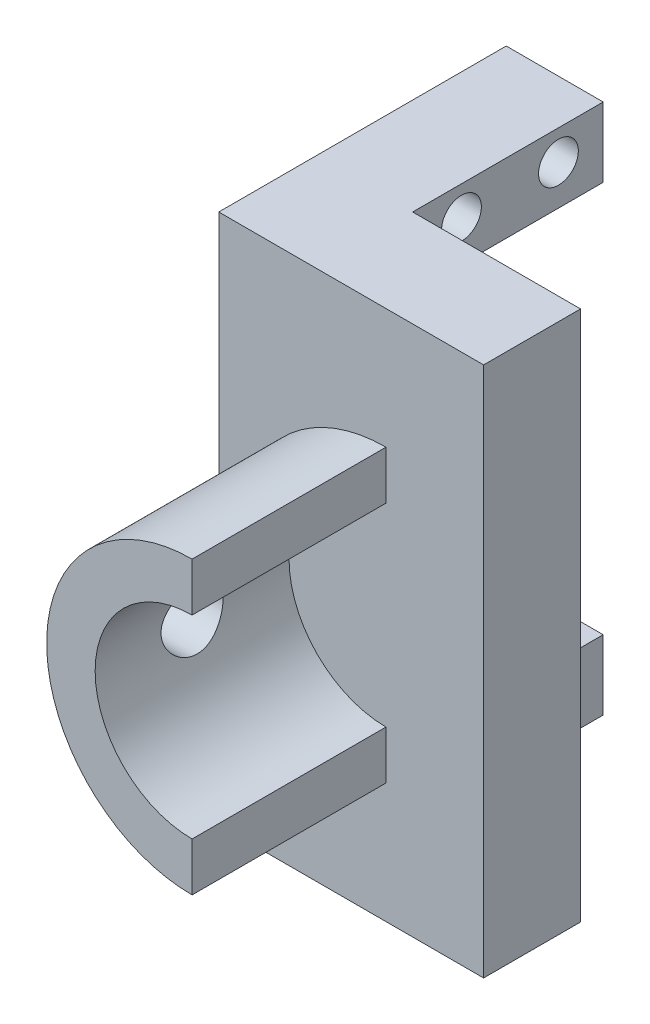
ISO-10303-21;
HEADER;
FILE_DESCRIPTION(('STEP AP214'),'2;1');
FILE_NAME('part.step','',(''),(''),'','','');
FILE_SCHEMA(('AUTOMOTIVE_DESIGN { 1 0 10303 214 1 1 1 1 }'));
ENDSEC;
DATA;
#1=APPLICATION_CONTEXT('core data for automotive mechanical design processes');
#2=APPLICATION_PROTOCOL_DEFINITION('international standard','automotive_design',2000,#1);
#3=PRODUCT_CONTEXT('',#1,'mechanical');
#4=PRODUCT('Part','Part','',(#3));
#5=PRODUCT_RELATED_PRODUCT_CATEGORY('part','',(#4));
#6=PRODUCT_DEFINITION_FORMATION('','',#4);
#7=PRODUCT_DEFINITION_CONTEXT('part definition',#1,'design');
#8=PRODUCT_DEFINITION('design','',#6,#7);
#9=PRODUCT_DEFINITION_SHAPE('','',#8);
#10=(LENGTH_UNIT() NAMED_UNIT(*) SI_UNIT(.MILLI.,.METRE.));
#11=(NAMED_UNIT(*) PLANE_ANGLE_UNIT() SI_UNIT($,.RADIAN.));
#12=(NAMED_UNIT(*) SI_UNIT($,.STERADIAN.) SOLID_ANGLE_UNIT());
#13=UNCERTAINTY_MEASURE_WITH_UNIT(LENGTH_MEASURE(1.E-05),#10,'distance_accuracy_value','');
#14=(GEOMETRIC_REPRESENTATION_CONTEXT(3) GLOBAL_UNCERTAINTY_ASSIGNED_CONTEXT((#13)) GLOBAL_UNIT_ASSIGNED_CONTEXT((#10,
#11,#12)) REPRESENTATION_CONTEXT('',''));
#15=CARTESIAN_POINT('',(0.,0.,0.));
#16=DIRECTION('',(0.,0.,1.));
#17=DIRECTION('',(1.,0.,0.));
#18=AXIS2_PLACEMENT_3D('',#15,#16,#17);
#19=CARTESIAN_POINT('',(0.,0.,-9.906));
#20=DIRECTION('',(0.,0.,-1.));
#21=DIRECTION('',(-1.,0.,0.));
#22=AXIS2_PLACEMENT_3D('',#19,#20,#21);
#23=PLANE('',#22);
#24=DIRECTION('',(0.,1.,0.));
#25=VECTOR('',#24,1.);
#26=CARTESIAN_POINT('',(9.97584999999999,27.1272,-9.906));
#27=LINE('',#26,#25);
#28=CARTESIAN_POINT('',(9.97584999999999,-27.1272,-9.906));
#29=VERTEX_POINT('',#28);
#30=CARTESIAN_POINT('',(9.97584999999999,27.1272,-9.906));
#31=VERTEX_POINT('',#30);
#32=EDGE_CURVE('E146',#29,#31,#27,.T.);
#33=ORIENTED_EDGE('',*,*,#32,.F.);
#34=DIRECTION('',(-1.,0.,0.));
#35=VECTOR('',#34,1.);
#36=CARTESIAN_POINT('',(-17.08785,-27.1272,-9.906));
#37=LINE('',#36,#35);
#38=CARTESIAN_POINT('',(-7.18185,-27.1272,-9.906));
#39=VERTEX_POINT('',#38);
#40=EDGE_CURVE('E154',#29,#39,#37,.T.);
#41=ORIENTED_EDGE('',*,*,#40,.T.);
#42=DIRECTION('',(0.,-1.,0.));
#43=VECTOR('',#42,1.);
#44=CARTESIAN_POINT('',(-7.18185,-27.1272,-9.906));
#45=LINE('',#44,#43);
#46=CARTESIAN_POINT('',(-7.18185,-20.0152,-9.906));
#47=VERTEX_POINT('',#46);
#48=EDGE_CURVE('E304',#47,#39,#45,.T.);
#49=ORIENTED_EDGE('',*,*,#48,.F.);
#50=DIRECTION('',(1.,0.,0.));
#51=VECTOR('',#50,1.);
#52=CARTESIAN_POINT('',(-17.08785,-20.0152,-9.906));
#53=LINE('',#52,#51);
#54=CARTESIAN_POINT('',(-17.08785,-20.0152,-9.906));
#55=VERTEX_POINT('',#54);
#56=EDGE_CURVE('E309',#55,#47,#53,.T.);
#57=ORIENTED_EDGE('',*,*,#56,.F.);
#58=DIRECTION('',(0.,1.,0.));
#59=VECTOR('',#58,1.);
#60=CARTESIAN_POINT('',(-17.08785,-27.1272,-9.906));
#61=LINE('',#60,#59);
#62=CARTESIAN_POINT('',(-17.08785,20.0152,-9.906));
#63=VERTEX_POINT('',#62);
#64=EDGE_CURVE('E167',#55,#63,#61,.T.);
#65=ORIENTED_EDGE('',*,*,#64,.T.);
#66=DIRECTION('',(-1.,0.,0.));
#67=VECTOR('',#66,1.);
#68=CARTESIAN_POINT('',(-17.08785,20.0152,-9.906));
#69=LINE('',#68,#67);
#70=CARTESIAN_POINT('',(-7.18185,20.0152,-9.906));
#71=VERTEX_POINT('',#70);
#72=EDGE_CURVE('E345',#71,#63,#69,.T.);
#73=ORIENTED_EDGE('',*,*,#72,.F.);
#74=DIRECTION('',(0.,-1.,0.));
#75=VECTOR('',#74,1.);
#76=CARTESIAN_POINT('',(-7.18185,27.1272,-9.906));
#77=LINE('',#76,#75);
#78=CARTESIAN_POINT('',(-7.18185,27.1272,-9.906));
#79=VERTEX_POINT('',#78);
#80=EDGE_CURVE('E319',#79,#71,#77,.T.);
#81=ORIENTED_EDGE('',*,*,#80,.F.);
#82=DIRECTION('',(1.,0.,0.));
#83=VECTOR('',#82,1.);
#84=CARTESIAN_POINT('',(-17.08785,27.1272,-9.906));
#85=LINE('',#84,#83);
#86=EDGE_CURVE('E158',#79,#31,#85,.T.);
#87=ORIENTED_EDGE('',*,*,#86,.T.);
#88=EDGE_LOOP('',(#33,#41,#49,#57,#65,#73,#81,#87));
#89=FACE_BOUND('',#88,.T.);
#90=ADVANCED_FACE('F42',(#89),#23,.T.);
#91=CARTESIAN_POINT('',(0.,0.,19.812));
#92=DIRECTION('',(0.,0.,-1.));
#93=DIRECTION('',(-1.,0.,0.));
#94=AXIS2_PLACEMENT_3D('',#91,#92,#93);
#95=CYLINDRICAL_SURFACE('',#94,9.906);
#96=CARTESIAN_POINT('',(-9.38340082272946,3.17500000000001,9.906));
#97=CARTESIAN_POINT('',(-9.38340133010901,3.17499953903506,9.73264884542391));
#98=CARTESIAN_POINT('',(-9.38825715963943,3.16075472324,9.55929209338769));
#99=CARTESIAN_POINT('',(-9.40706434772498,3.1043257570464,9.21768781886109));
#100=CARTESIAN_POINT('',(-9.42101779273341,3.06213519751669,9.04944147766173));
#101=CARTESIAN_POINT('',(-9.45628094770359,2.95142750605806,8.7230576836702));
#102=CARTESIAN_POINT('',(-9.47757710955197,2.88295883397299,8.56490224453796));
#103=CARTESIAN_POINT('',(-9.52510700553775,2.72180167990557,8.26227622172001));
#104=CARTESIAN_POINT('',(-9.55134169611072,2.62910850505674,8.11780829703056));
#105=CARTESIAN_POINT('',(-9.60685630655788,2.41854478822556,7.84143587130159));
#106=CARTESIAN_POINT('',(-9.63620787712043,2.29994827423912,7.71009873342643));
#107=CARTESIAN_POINT('',(-9.6940409357979,2.04249629356499,7.46879483813952));
#108=CARTESIAN_POINT('',(-9.72252229521997,1.90363784777256,7.35883122882422));
#109=CARTESIAN_POINT('',(-9.77622921809102,1.60549943387128,7.16086560894773));
#110=CARTESIAN_POINT('',(-9.80136062407833,1.44581048456765,7.07345173560357));
#111=CARTESIAN_POINT('',(-9.84469647245604,1.11305344149498,6.9269464698132));
#112=CARTESIAN_POINT('',(-9.86290263233179,0.939988677802082,6.86784805408899));
#113=CARTESIAN_POINT('',(-9.88982935915226,0.591336355969303,6.78155683094694));
#114=CARTESIAN_POINT('',(-9.89883780880962,0.41601165347821,6.7533934648548));
#115=CARTESIAN_POINT('',(-9.90737280091693,0.0629093181982272,6.72669255035582));
#116=CARTESIAN_POINT('',(-9.90690160743614,-0.114867718751698,6.72814792796135));
#117=CARTESIAN_POINT('',(-9.89672883377991,-0.460982753354979,6.76001333816891));
#118=CARTESIAN_POINT('',(-9.88736291172926,-0.629429142765774,6.78937047998244));
#119=CARTESIAN_POINT('',(-9.86086911434444,-0.958864233681696,6.87447336134971));
#120=CARTESIAN_POINT('',(-9.84374072449016,-1.11985244005587,6.93022085014729));
#121=CARTESIAN_POINT('',(-9.80320475439315,-1.43218240257421,7.0671748715743));
#122=CARTESIAN_POINT('',(-9.77972077356479,-1.58337705006025,7.14869334628164));
#123=CARTESIAN_POINT('',(-9.72893673648756,-1.87026250480182,7.33462259159284));
#124=CARTESIAN_POINT('',(-9.70163567836561,-2.0059492246236,7.43903937644866));
#125=CARTESIAN_POINT('',(-9.64470398038788,-2.26424039095278,7.67316958474088));
#126=CARTESIAN_POINT('',(-9.61502367587066,-2.38601336778421,7.80378949197259));
#127=CARTESIAN_POINT('',(-9.55769991346078,-2.60618195859897,8.08386523472301));
#128=CARTESIAN_POINT('',(-9.53005672249221,-2.70457451277706,8.23332353171653));
#129=CARTESIAN_POINT('',(-9.47967827585143,-2.87622483297347,8.5492898728612));
#130=CARTESIAN_POINT('',(-9.45700756438128,-2.94915858260893,8.71598500409704));
#131=CARTESIAN_POINT('',(-9.41989380059001,-3.06565137470001,9.06019545607295));
#132=CARTESIAN_POINT('',(-9.40544760898891,-3.10922162630249,9.23770661967933));
#133=CARTESIAN_POINT('',(-9.38712048822755,-3.16411316255718,9.59051034557862));
#134=CARTESIAN_POINT('',(-9.38282074126458,-3.17671375743821,9.76558219887671));
#135=CARTESIAN_POINT('',(-9.38410752367471,-3.17291201870695,10.1153562264413));
#136=CARTESIAN_POINT('',(-9.3896924268535,-3.15651445578879,10.2900584567832));
#137=CARTESIAN_POINT('',(-9.40970418756109,-3.09632761940791,10.6285100976424));
#138=CARTESIAN_POINT('',(-9.42385227170711,-3.05340110038972,10.7924311465685));
#139=CARTESIAN_POINT('',(-9.45909661381935,-2.94239621229261,11.1107203518729));
#140=CARTESIAN_POINT('',(-9.48019404316233,-2.874313602685,11.2650868925355));
#141=CARTESIAN_POINT('',(-9.52774108643855,-2.71261315798632,11.5649877749034));
#142=CARTESIAN_POINT('',(-9.55433167781735,-2.61829369124762,11.7101208739917));
#143=CARTESIAN_POINT('',(-9.6095840888019,-2.40760687283756,11.9829644804155));
#144=CARTESIAN_POINT('',(-9.63824647277214,-2.29123349948743,12.1106702128999));
#145=CARTESIAN_POINT('',(-9.69593652535424,-2.03366431016807,12.3508260247314));
#146=CARTESIAN_POINT('',(-9.72492491808365,-1.89160256664382,12.4623593617688));
#147=CARTESIAN_POINT('',(-9.77874854404601,-1.59007310585205,12.6600487687238));
#148=CARTESIAN_POINT('',(-9.80358395359351,-1.43060612799761,12.7462059161037));
#149=CARTESIAN_POINT('',(-9.84617005172749,-1.09971270486089,12.889881003148));
#150=CARTESIAN_POINT('',(-9.86397024277404,-0.92838016838966,12.9475997824493));
#151=CARTESIAN_POINT('',(-9.89069687851541,-0.577764235401472,13.0331949986557));
#152=CARTESIAN_POINT('',(-9.89962625951355,-0.398483490340113,13.0610813105617));
#153=CARTESIAN_POINT('',(-9.90740032725738,-0.0454781964175458,13.0853846800917));
#154=CARTESIAN_POINT('',(-9.90666835072807,0.128147126546088,13.0831227161865));
#155=CARTESIAN_POINT('',(-9.89622665348614,0.472430473192687,13.0504124254821));
#156=CARTESIAN_POINT('',(-9.88651757068729,0.643088706839338,13.0199661014652));
#157=CARTESIAN_POINT('',(-9.85935481238169,0.974277122404261,12.9326065929411));
#158=CARTESIAN_POINT('',(-9.84200938210128,1.13491424665938,12.8760628163297));
#159=CARTESIAN_POINT('',(-9.80136097448059,1.44449364041947,12.7384499976972));
#160=CARTESIAN_POINT('',(-9.77805695157488,1.59343385144344,12.6573766509682));
#161=CARTESIAN_POINT('',(-9.72689320608753,1.88108625417519,12.4697193240969));
#162=CARTESIAN_POINT('',(-9.69890225138927,2.01925567841205,12.362339546976));
#163=CARTESIAN_POINT('',(-9.64187566236921,2.27605033064853,12.1265019402886));
#164=CARTESIAN_POINT('',(-9.61283970977304,2.39466954181593,11.9980376458753));
#165=CARTESIAN_POINT('',(-9.55578495937843,2.61324313994996,11.7182354017688));
#166=CARTESIAN_POINT('',(-9.52783848079125,2.71238880180854,11.5662490463719));
#167=CARTESIAN_POINT('',(-9.47742003674041,2.88363592085698,11.2469186132444));
#168=CARTESIAN_POINT('',(-9.45494614536393,2.95574689692776,11.0795799669172));
#169=CARTESIAN_POINT('',(-9.41960211858886,3.06644435894395,10.7463403432));
#170=CARTESIAN_POINT('',(-9.40616879103593,3.10702803003376,10.5811622748788));
#171=CARTESIAN_POINT('',(-9.38806912491434,3.16130230167822,10.2459903549994));
#172=CARTESIAN_POINT('',(-9.38340032516461,3.1750004520481,10.0759978690004));
#173=CARTESIAN_POINT('',(-9.38340082272946,3.17500000000001,9.906));
#174=B_SPLINE_CURVE_WITH_KNOTS('',3,(#96,#97,#98,#99,#100,#101,#102,#103,#104,#105,#106,#107,
#108,#109,#110,#111,#112,#113,#114,#115,#116,#117,#118,#119,#120,#121,#122,#123,#124,#125,#126,
#127,#128,#129,#130,#131,#132,#133,#134,#135,#136,#137,#138,#139,#140,#141,#142,#143,#144,#145,
#146,#147,#148,#149,#150,#151,#152,#153,#154,#155,#156,#157,#158,#159,#160,#161,#162,#163,#164,
#165,#166,#167,#168,#169,#170,#171,#172,#173),.UNSPECIFIED.,.T.,.F.,(4,2,2,2,2,2,2,2,2,2,2,2,2,
2,2,2,2,2,2,2,2,2,2,2,2,2,2,2,2,2,2,2,2,2,2,2,2,2,4),(0.,0.519424913270037,1.03896899372475,
1.557559543668,2.07625063159029,2.61195145698115,3.14773112578965,3.69632464246906,
4.24478201718656,4.77549171645942,5.30607466525916,5.81739893053467,6.32875709290453,
6.84655855087935,7.36449617288678,7.90508126396071,8.44573706270556,8.99304239171275,
9.54013867525676,10.0642241589064,10.5882234295295,11.0960183198061,11.6038988474713,
12.1269412246057,12.6501266214326,13.1962977107937,13.742445606616,14.2846791015578,
14.8267330533656,15.3451174273333,15.863464967704,16.3746903114133,16.8860054224304,
17.4152743224352,17.94470580888,18.4928662860357,19.0408335748635,19.550353890646,
20.0597311057994),.UNSPECIFIED.);
#175=CARTESIAN_POINT('',(-9.38340082272946,3.17500000000001,9.906));
#176=VERTEX_POINT('',#175);
#177=EDGE_CURVE('E196',#176,#176,#174,.T.);
#178=ORIENTED_EDGE('',*,*,#177,.T.);
#179=EDGE_LOOP('',(#178));
#180=FACE_BOUND('',#179,.T.);
#181=CARTESIAN_POINT('',(0.,0.,0.));
#182=DIRECTION('',(0.,0.,-1.));
#183=DIRECTION('',(1.,0.,0.));
#184=AXIS2_PLACEMENT_3D('',#181,#182,#183);
#185=CIRCLE('',#184,9.906);
#186=CARTESIAN_POINT('',(0.,-9.906,0.));
#187=VERTEX_POINT('',#186);
#188=CARTESIAN_POINT('',(0.,9.906,0.));
#189=VERTEX_POINT('',#188);
#190=EDGE_CURVE('E204',#187,#189,#185,.T.);
#191=ORIENTED_EDGE('',*,*,#190,.T.);
#192=DIRECTION('',(0.,0.,-1.));
#193=VECTOR('',#192,1.);
#194=CARTESIAN_POINT('',(0.,9.906,19.812));
#195=LINE('',#194,#193);
#196=CARTESIAN_POINT('',(0.,9.906,19.812));
#197=VERTEX_POINT('',#196);
#198=EDGE_CURVE('E226',#197,#189,#195,.T.);
#199=ORIENTED_EDGE('',*,*,#198,.F.);
#200=CARTESIAN_POINT('',(0.,0.,19.812));
#201=DIRECTION('',(0.,0.,-1.));
#202=DIRECTION('',(1.,0.,0.));
#203=AXIS2_PLACEMENT_3D('',#200,#201,#202);
#204=CIRCLE('',#203,9.906);
#205=CARTESIAN_POINT('',(0.,-9.906,19.812));
#206=VERTEX_POINT('',#205);
#207=EDGE_CURVE('E205',#206,#197,#204,.T.);
#208=ORIENTED_EDGE('',*,*,#207,.F.);
#209=DIRECTION('',(0.,0.,-1.));
#210=VECTOR('',#209,1.);
#211=CARTESIAN_POINT('',(0.,-9.906,19.812));
#212=LINE('',#211,#210);
#213=EDGE_CURVE('E610',#206,#187,#212,.T.);
#214=ORIENTED_EDGE('',*,*,#213,.T.);
#215=EDGE_LOOP('',(#191,#199,#208,#214));
#216=FACE_BOUND('',#215,.T.);
#217=ADVANCED_FACE('F44',(#180,#216),#95,.F.);
#218=CARTESIAN_POINT('',(0.,14.859,19.812));
#219=DIRECTION('',(-1.,0.,0.));
#220=DIRECTION('',(0.,-1.,0.));
#221=AXIS2_PLACEMENT_3D('',#218,#219,#220);
#222=PLANE('',#221);
#223=DIRECTION('',(0.,1.,0.));
#224=VECTOR('',#223,1.);
#225=CARTESIAN_POINT('',(0.,14.859,0.));
#226=LINE('',#225,#224);
#227=CARTESIAN_POINT('',(0.,14.859,0.));
#228=VERTEX_POINT('',#227);
#229=EDGE_CURVE('E639',#189,#228,#226,.T.);
#230=ORIENTED_EDGE('',*,*,#229,.T.);
#231=DIRECTION('',(0.,0.,-1.));
#232=VECTOR('',#231,1.);
#233=CARTESIAN_POINT('',(0.,14.859,19.812));
#234=LINE('',#233,#232);
#235=CARTESIAN_POINT('',(0.,14.859,19.812));
#236=VERTEX_POINT('',#235);
#237=EDGE_CURVE('E627',#236,#228,#234,.T.);
#238=ORIENTED_EDGE('',*,*,#237,.F.);
#239=DIRECTION('',(0.,1.,0.));
#240=VECTOR('',#239,1.);
#241=CARTESIAN_POINT('',(0.,14.859,19.812));
#242=LINE('',#241,#240);
#243=EDGE_CURVE('E640',#197,#236,#242,.T.);
#244=ORIENTED_EDGE('',*,*,#243,.F.);
#245=ORIENTED_EDGE('',*,*,#198,.T.);
#246=EDGE_LOOP('',(#230,#238,#244,#245));
#247=FACE_BOUND('',#246,.T.);
#248=ADVANCED_FACE('F234',(#247),#222,.F.);
#249=CARTESIAN_POINT('',(0.,0.,19.812));
#250=DIRECTION('',(0.,0.,-1.));
#251=DIRECTION('',(-1.,0.,0.));
#252=AXIS2_PLACEMENT_3D('',#249,#250,#251);
#253=CYLINDRICAL_SURFACE('',#252,14.859);
#254=CARTESIAN_POINT('',(-14.859,0.,6.731));
#255=CARTESIAN_POINT('',(-14.8589967402807,0.176194698758512,6.73100615390929));
#256=CARTESIAN_POINT('',(-14.8558341487316,0.352464690339494,6.74571625608523));
#257=CARTESIAN_POINT('',(-14.8435232946697,0.700004573215136,6.80411091777772));
#258=CARTESIAN_POINT('',(-14.8343706220879,0.871270683386047,6.84781682516054));
#259=CARTESIAN_POINT('',(-14.8110995060966,1.20372928824128,6.9627770763868));
#260=CARTESIAN_POINT('',(-14.7969861321986,1.36493186988359,7.0340033036166));
#261=CARTESIAN_POINT('',(-14.7653198994555,1.67309151540792,7.20189466092664));
#262=CARTESIAN_POINT('',(-14.7477671614983,1.82004907970693,7.29855889694484));
#263=CARTESIAN_POINT('',(-14.710846253574,2.09781055044508,7.5161536710301));
#264=CARTESIAN_POINT('',(-14.6914564283995,2.22836438439464,7.63739978296034));
#265=CARTESIAN_POINT('',(-14.6532006490009,2.46744492072694,7.90003883947733));
#266=CARTESIAN_POINT('',(-14.6343347399326,2.57596972949991,8.04143351425317));
#267=CARTESIAN_POINT('',(-14.5990499486353,2.76900411692624,8.34219107927886));
#268=CARTESIAN_POINT('',(-14.582658848184,2.85324949654867,8.50172708938338));
#269=CARTESIAN_POINT('',(-14.5544894851331,2.99363950909869,8.833099328121));
#270=CARTESIAN_POINT('',(-14.5427106979775,3.04978733774958,9.00493415538473));
#271=CARTESIAN_POINT('',(-14.5253197612627,3.13156600030011,9.35331960636047));
#272=CARTESIAN_POINT('',(-14.5196184594067,3.15763849872747,9.52976201109498));
#273=CARTESIAN_POINT('',(-14.5147601053329,3.17989930053807,9.88460166685972));
#274=CARTESIAN_POINT('',(-14.5156022866531,3.17609110395543,10.0629986864944));
#275=CARTESIAN_POINT('',(-14.5236549469871,3.13905450421082,10.4134147192979));
#276=CARTESIAN_POINT('',(-14.5307547717111,3.10633727598315,10.5854906867116));
#277=CARTESIAN_POINT('',(-14.5503479995654,3.01322036016634,10.9216536547528));
#278=CARTESIAN_POINT('',(-14.5628416928619,2.95281918329287,11.0857402250577));
#279=CARTESIAN_POINT('',(-14.5919251097965,2.80557439137451,11.4027136334561));
#280=CARTESIAN_POINT('',(-14.6085453576114,2.71853254467572,11.5555054691589));
#281=CARTESIAN_POINT('',(-14.6439902404162,2.52061672720434,11.8445044122576));
#282=CARTESIAN_POINT('',(-14.6628151627169,2.40973964867375,11.980709353339));
#283=CARTESIAN_POINT('',(-14.7010243625657,2.16458623564626,12.2356130149233));
#284=CARTESIAN_POINT('',(-14.720412172529,2.02987477520951,12.3538931194276));
#285=CARTESIAN_POINT('',(-14.7572088033606,1.74231101142479,12.5662488511058));
#286=CARTESIAN_POINT('',(-14.7746175914816,1.58945840797806,12.6603240777902));
#287=CARTESIAN_POINT('',(-14.8055471952626,1.26945312621002,12.8216957581053));
#288=CARTESIAN_POINT('',(-14.8190603155283,1.10227297892278,12.888939308424));
#289=CARTESIAN_POINT('',(-14.8406185257147,0.758634071300985,12.994265263433));
#290=CARTESIAN_POINT('',(-14.8486643736777,0.582176600932672,13.0323517108756));
#291=CARTESIAN_POINT('',(-14.8582742394268,0.228584601098124,13.0776779685338));
#292=CARTESIAN_POINT('',(-14.8599584618844,0.0515265824636866,13.0854898988191));
#293=CARTESIAN_POINT('',(-14.8569913313245,-0.301364506824073,13.0715933167132));
#294=CARTESIAN_POINT('',(-14.8523403874159,-0.477197655839346,13.0498867105537));
#295=CARTESIAN_POINT('',(-14.8373011908791,-0.820766007096623,12.9780439161293));
#296=CARTESIAN_POINT('',(-14.8269731603418,-0.988566448702825,12.9282059959457));
#297=CARTESIAN_POINT('',(-14.8017350583752,-1.31342688303457,12.8018449249043));
#298=CARTESIAN_POINT('',(-14.7868246090968,-1.47048598876366,12.7253195734306));
#299=CARTESIAN_POINT('',(-14.7537781674759,-1.77178429310711,12.5465512260452));
#300=CARTESIAN_POINT('',(-14.7356007292247,-1.91581804912945,12.4439698043498));
#301=CARTESIAN_POINT('',(-14.6981246260166,-2.18483259780773,12.2164489351539));
#302=CARTESIAN_POINT('',(-14.6788258227448,-2.30981103316596,12.0915067255918));
#303=CARTESIAN_POINT('',(-14.6408696487408,-2.53941433408468,11.8201911507116));
#304=CARTESIAN_POINT('',(-14.6222294557648,-2.64364394108118,11.6734804545196));
#305=CARTESIAN_POINT('',(-14.5880886017231,-2.82598520570271,11.3642996057269));
#306=CARTESIAN_POINT('',(-14.5725878071325,-2.90409797422067,11.2018301238134));
#307=CARTESIAN_POINT('',(-14.5466243436289,-3.03147339907523,10.8666036860708));
#308=CARTESIAN_POINT('',(-14.5361339260237,-3.08089528887863,10.6939094881385));
#309=CARTESIAN_POINT('',(-14.5213263423454,-3.14995753034486,10.3424161010803));
#310=CARTESIAN_POINT('',(-14.5170082406671,-3.16960239566276,10.1636178414214));
#311=CARTESIAN_POINT('',(-14.5150912315555,-3.17836771261522,9.8089721693341));
#312=CARTESIAN_POINT('',(-14.5173545070886,-3.16811423663552,9.6331406837942));
#313=CARTESIAN_POINT('',(-14.5280345997088,-3.11876859344065,9.28577237702738));
#314=CARTESIAN_POINT('',(-14.5364513510251,-3.07967673446212,9.11423550991804));
#315=CARTESIAN_POINT('',(-14.5584243795644,-2.97406016283385,8.78079556895384));
#316=CARTESIAN_POINT('',(-14.5719643201825,-2.90762259049435,8.61886374601909));
#317=CARTESIAN_POINT('',(-14.6026652794361,-2.74927689188875,8.30835060375248));
#318=CARTESIAN_POINT('',(-14.6198266552515,-2.65736625294939,8.15977060336522));
#319=CARTESIAN_POINT('',(-14.6562513058028,-2.44858969371564,7.877083683838));
#320=CARTESIAN_POINT('',(-14.6755487857802,-2.33127591068657,7.74331187557933));
#321=CARTESIAN_POINT('',(-14.713837225414,-2.07593566464662,7.49714723193885));
#322=CARTESIAN_POINT('',(-14.7328281133487,-1.93790443074961,7.38475933447168));
#323=CARTESIAN_POINT('',(-14.7686392925732,-1.64300992132539,7.18323864343173));
#324=CARTESIAN_POINT('',(-14.7854301256152,-1.48593655747747,7.09440777380225));
#325=CARTESIAN_POINT('',(-14.814655517228,-1.15876647372612,6.94454745294218));
#326=CARTESIAN_POINT('',(-14.8270938037094,-0.988681051443419,6.88349419695408));
#327=CARTESIAN_POINT('',(-14.8439381172694,-0.681970334153463,6.8020674188608));
#328=CARTESIAN_POINT('',(-14.8495518817154,-0.547029695802136,6.77546704221143));
#329=CARTESIAN_POINT('',(-14.8570840190329,-0.274741233884757,6.73993129186872));
#330=CARTESIAN_POINT('',(-14.8590025418715,-0.137393508235846,6.73099520129043));
#331=CARTESIAN_POINT('',(-14.859,0.,6.731));
#332=B_SPLINE_CURVE_WITH_KNOTS('',3,(#254,#255,#256,#257,#258,#259,#260,#261,#262,#263,#264,
#265,#266,#267,#268,#269,#270,#271,#272,#273,#274,#275,#276,#277,#278,#279,#280,#281,#282,#283,
#284,#285,#286,#287,#288,#289,#290,#291,#292,#293,#294,#295,#296,#297,#298,#299,#300,#301,#302,
#303,#304,#305,#306,#307,#308,#309,#310,#311,#312,#313,#314,#315,#316,#317,#318,#319,#320,#321,
#322,#323,#324,#325,#326,#327,#328,#329,#330,#331),.UNSPECIFIED.,.T.,.F.,(4,2,2,2,2,2,2,2,2,2,2,
2,2,2,2,2,2,2,2,2,2,2,2,2,2,2,2,2,2,2,2,2,2,2,2,2,2,2,4),(0.,0.528081262460858,1.0565517514778,
1.58448374102957,2.11239717799228,2.64757401290652,3.18279683203095,3.72364100219877,
4.26442364453558,4.79715937397165,5.32983270307218,5.85327157616608,6.37673861145725,
6.90419954064707,7.43172928461683,7.97013042940942,8.50854048191244,9.0480069191691,
9.58739854362747,10.1165457053767,10.645658697776,11.1692642866017,11.6929130615744,
12.2237459587688,12.7546444711098,13.2948508040972,13.8350341562106,14.3721901169986,
14.9092646465717,15.4351741051875,15.9610779427456,16.4853187436111,17.0096112742104,
17.544033956719,18.0785798972879,18.6196778012776,19.1603111196782,19.572116256461,
19.9839046802578),.UNSPECIFIED.);
#333=CARTESIAN_POINT('',(-14.859,0.,6.731));
#334=VERTEX_POINT('',#333);
#335=EDGE_CURVE('E52',#334,#334,#332,.T.);
#336=ORIENTED_EDGE('',*,*,#335,.T.);
#337=EDGE_LOOP('',(#336));
#338=FACE_BOUND('',#337,.T.);
#339=CARTESIAN_POINT('',(0.,0.,0.));
#340=DIRECTION('',(0.,0.,1.));
#341=DIRECTION('',(1.,0.,0.));
#342=AXIS2_PLACEMENT_3D('',#339,#340,#341);
#343=CIRCLE('',#342,14.859);
#344=CARTESIAN_POINT('',(0.,-14.859,0.));
#345=VERTEX_POINT('',#344);
#346=EDGE_CURVE('E616',#228,#345,#343,.T.);
#347=ORIENTED_EDGE('',*,*,#346,.T.);
#348=DIRECTION('',(0.,0.,-1.));
#349=VECTOR('',#348,1.);
#350=CARTESIAN_POINT('',(0.,-14.859,19.812));
#351=LINE('',#350,#349);
#352=CARTESIAN_POINT('',(0.,-14.859,19.812));
#353=VERTEX_POINT('',#352);
#354=EDGE_CURVE('E613',#353,#345,#351,.T.);
#355=ORIENTED_EDGE('',*,*,#354,.F.);
#356=CARTESIAN_POINT('',(0.,0.,19.812));
#357=DIRECTION('',(0.,0.,1.));
#358=DIRECTION('',(1.,0.,0.));
#359=AXIS2_PLACEMENT_3D('',#356,#357,#358);
#360=CIRCLE('',#359,14.859);
#361=EDGE_CURVE('E629',#236,#353,#360,.T.);
#362=ORIENTED_EDGE('',*,*,#361,.F.);
#363=ORIENTED_EDGE('',*,*,#237,.T.);
#364=EDGE_LOOP('',(#347,#355,#362,#363));
#365=FACE_BOUND('',#364,.T.);
#366=ADVANCED_FACE('F230',(#338,#365),#253,.T.);
#367=CARTESIAN_POINT('',(0.,-9.906,19.812));
#368=DIRECTION('',(-1.,0.,0.));
#369=DIRECTION('',(0.,-1.,0.));
#370=AXIS2_PLACEMENT_3D('',#367,#368,#369);
#371=PLANE('',#370);
#372=DIRECTION('',(0.,1.,0.));
#373=VECTOR('',#372,1.);
#374=CARTESIAN_POINT('',(0.,-9.906,0.));
#375=LINE('',#374,#373);
#376=EDGE_CURVE('E607',#345,#187,#375,.T.);
#377=ORIENTED_EDGE('',*,*,#376,.T.);
#378=ORIENTED_EDGE('',*,*,#213,.F.);
#379=DIRECTION('',(0.,1.,0.));
#380=VECTOR('',#379,1.);
#381=CARTESIAN_POINT('',(0.,-9.906,19.812));
#382=LINE('',#381,#380);
#383=EDGE_CURVE('E623',#353,#206,#382,.T.);
#384=ORIENTED_EDGE('',*,*,#383,.F.);
#385=ORIENTED_EDGE('',*,*,#354,.T.);
#386=EDGE_LOOP('',(#377,#378,#384,#385));
#387=FACE_BOUND('',#386,.T.);
#388=ADVANCED_FACE('F233',(#387),#371,.F.);
#389=CARTESIAN_POINT('',(0.,0.,19.812));
#390=DIRECTION('',(0.,0.,1.));
#391=DIRECTION('',(1.,0.,0.));
#392=AXIS2_PLACEMENT_3D('',#389,#390,#391);
#393=PLANE('',#392);
#394=ORIENTED_EDGE('',*,*,#207,.T.);
#395=ORIENTED_EDGE('',*,*,#243,.T.);
#396=ORIENTED_EDGE('',*,*,#361,.T.);
#397=ORIENTED_EDGE('',*,*,#383,.T.);
#398=EDGE_LOOP('',(#394,#395,#396,#397));
#399=FACE_BOUND('',#398,.T.);
#400=ADVANCED_FACE('F212',(#399),#393,.T.);
#401=CARTESIAN_POINT('',(-14.859,0.,9.906));
#402=DIRECTION('',(1.,0.,0.));
#403=DIRECTION('',(0.,1.,0.));
#404=AXIS2_PLACEMENT_3D('',#401,#402,#403);
#405=CYLINDRICAL_SURFACE('',#404,3.175);
#406=ORIENTED_EDGE('',*,*,#335,.F.);
#407=EDGE_LOOP('',(#406));
#408=FACE_BOUND('',#407,.T.);
#409=ORIENTED_EDGE('',*,*,#177,.F.);
#410=EDGE_LOOP('',(#409));
#411=FACE_BOUND('',#410,.T.);
#412=ADVANCED_FACE('F207',(#408,#411),#405,.F.);
#413=CARTESIAN_POINT('',(-17.08785,-27.1272,-9.906));
#414=DIRECTION('',(0.,1.,0.));
#415=DIRECTION('',(-1.,0.,0.));
#416=AXIS2_PLACEMENT_3D('',#413,#414,#415);
#417=PLANE('',#416);
#418=ORIENTED_EDGE('',*,*,#40,.F.);
#419=DIRECTION('',(0.,0.,-1.));
#420=VECTOR('',#419,1.);
#421=CARTESIAN_POINT('',(9.97584999999999,-27.1272,19.812));
#422=LINE('',#421,#420);
#423=CARTESIAN_POINT('',(9.97584999999999,-27.1272,0.));
#424=VERTEX_POINT('',#423);
#425=EDGE_CURVE('E143',#424,#29,#422,.T.);
#426=ORIENTED_EDGE('',*,*,#425,.F.);
#427=DIRECTION('',(-1.,0.,0.));
#428=VECTOR('',#427,1.);
#429=CARTESIAN_POINT('',(-17.08785,-27.1272,0.));
#430=LINE('',#429,#428);
#431=CARTESIAN_POINT('',(-17.08785,-27.1272,0.));
#432=VERTEX_POINT('',#431);
#433=EDGE_CURVE('E184',#424,#432,#430,.T.);
#434=ORIENTED_EDGE('',*,*,#433,.T.);
#435=DIRECTION('',(0.,0.,1.));
#436=VECTOR('',#435,1.);
#437=CARTESIAN_POINT('',(-17.08785,-27.1272,-9.906));
#438=LINE('',#437,#436);
#439=CARTESIAN_POINT('',(-17.08785,-27.1272,-29.3751));
#440=VERTEX_POINT('',#439);
#441=EDGE_CURVE('E192',#440,#432,#438,.T.);
#442=ORIENTED_EDGE('',*,*,#441,.F.);
#443=DIRECTION('',(-1.,0.,0.));
#444=VECTOR('',#443,1.);
#445=CARTESIAN_POINT('',(-17.08785,-27.1272,-29.3751));
#446=LINE('',#445,#444);
#447=CARTESIAN_POINT('',(-7.18185,-27.1272,-29.3751));
#448=VERTEX_POINT('',#447);
#449=EDGE_CURVE('E290',#448,#440,#446,.T.);
#450=ORIENTED_EDGE('',*,*,#449,.F.);
#451=DIRECTION('',(0.,0.,1.));
#452=VECTOR('',#451,1.);
#453=CARTESIAN_POINT('',(-7.18185,-27.1272,-29.3751));
#454=LINE('',#453,#452);
#455=EDGE_CURVE('E165',#448,#39,#454,.T.);
#456=ORIENTED_EDGE('',*,*,#455,.T.);
#457=EDGE_LOOP('',(#418,#426,#434,#442,#450,#456));
#458=FACE_BOUND('',#457,.T.);
#459=ADVANCED_FACE('F162',(#458),#417,.F.);
#460=CARTESIAN_POINT('',(-17.08785,-27.1272,-9.906));
#461=DIRECTION('',(1.,0.,0.));
#462=DIRECTION('',(0.,0.,-1.));
#463=AXIS2_PLACEMENT_3D('',#460,#461,#462);
#464=PLANE('',#463);
#465=CARTESIAN_POINT('',(-17.08785,-24.0792,-24.8031));
#466=DIRECTION('',(-1.,0.,0.));
#467=DIRECTION('',(0.,0.,-1.));
#468=AXIS2_PLACEMENT_3D('',#465,#466,#467);
#469=CIRCLE('',#468,2.032);
#470=CARTESIAN_POINT('',(-17.08785,-24.0792,-26.8351));
#471=VERTEX_POINT('',#470);
#472=EDGE_CURVE('E267',#471,#471,#469,.T.);
#473=ORIENTED_EDGE('',*,*,#472,.F.);
#474=EDGE_LOOP('',(#473));
#475=FACE_BOUND('',#474,.T.);
#476=CARTESIAN_POINT('',(-17.08785,-24.0792,-14.8971));
#477=DIRECTION('',(-1.,0.,0.));
#478=DIRECTION('',(0.,0.,-1.));
#479=AXIS2_PLACEMENT_3D('',#476,#477,#478);
#480=CIRCLE('',#479,2.032);
#481=CARTESIAN_POINT('',(-17.08785,-24.0792,-16.9291));
#482=VERTEX_POINT('',#481);
#483=EDGE_CURVE('E271',#482,#482,#480,.T.);
#484=ORIENTED_EDGE('',*,*,#483,.F.);
#485=EDGE_LOOP('',(#484));
#486=FACE_BOUND('',#485,.T.);
#487=CARTESIAN_POINT('',(-17.08785,24.0792,-14.8971));
#488=DIRECTION('',(-1.,0.,0.));
#489=DIRECTION('',(0.,0.,1.));
#490=AXIS2_PLACEMENT_3D('',#487,#488,#489);
#491=CIRCLE('',#490,2.032);
#492=CARTESIAN_POINT('',(-17.08785,24.0792,-12.8651));
#493=VERTEX_POINT('',#492);
#494=EDGE_CURVE('E275',#493,#493,#491,.T.);
#495=ORIENTED_EDGE('',*,*,#494,.F.);
#496=EDGE_LOOP('',(#495));
#497=FACE_BOUND('',#496,.T.);
#498=CARTESIAN_POINT('',(-17.08785,24.0792,-24.8031));
#499=DIRECTION('',(-1.,0.,0.));
#500=DIRECTION('',(0.,0.,1.));
#501=AXIS2_PLACEMENT_3D('',#498,#499,#500);
#502=CIRCLE('',#501,2.032);
#503=CARTESIAN_POINT('',(-17.08785,24.0792,-22.7711));
#504=VERTEX_POINT('',#503);
#505=EDGE_CURVE('E279',#504,#504,#502,.T.);
#506=ORIENTED_EDGE('',*,*,#505,.F.);
#507=EDGE_LOOP('',(#506));
#508=FACE_BOUND('',#507,.T.);
#509=DIRECTION('',(0.,1.,0.));
#510=VECTOR('',#509,1.);
#511=CARTESIAN_POINT('',(-17.08785,-27.1272,0.));
#512=LINE('',#511,#510);
#513=CARTESIAN_POINT('',(-17.08785,27.1272,0.));
#514=VERTEX_POINT('',#513);
#515=EDGE_CURVE('E175',#432,#514,#512,.T.);
#516=ORIENTED_EDGE('',*,*,#515,.T.);
#517=DIRECTION('',(0.,0.,1.));
#518=VECTOR('',#517,1.);
#519=CARTESIAN_POINT('',(-17.08785,27.1272,-9.906));
#520=LINE('',#519,#518);
#521=CARTESIAN_POINT('',(-17.08785,27.1272,-29.3751));
#522=VERTEX_POINT('',#521);
#523=EDGE_CURVE('E183',#522,#514,#520,.T.);
#524=ORIENTED_EDGE('',*,*,#523,.F.);
#525=DIRECTION('',(0.,1.,0.));
#526=VECTOR('',#525,1.);
#527=CARTESIAN_POINT('',(-17.08785,27.1272,-29.3751));
#528=LINE('',#527,#526);
#529=CARTESIAN_POINT('',(-17.08785,20.0152,-29.3751));
#530=VERTEX_POINT('',#529);
#531=EDGE_CURVE('E312',#530,#522,#528,.T.);
#532=ORIENTED_EDGE('',*,*,#531,.F.);
#533=DIRECTION('',(0.,0.,1.));
#534=VECTOR('',#533,1.);
#535=CARTESIAN_POINT('',(-17.08785,20.0152,-29.3751));
#536=LINE('',#535,#534);
#537=EDGE_CURVE('E333',#530,#63,#536,.T.);
#538=ORIENTED_EDGE('',*,*,#537,.T.);
#539=ORIENTED_EDGE('',*,*,#64,.F.);
#540=DIRECTION('',(0.,0.,1.));
#541=VECTOR('',#540,1.);
#542=CARTESIAN_POINT('',(-17.08785,-20.0152,-29.3751));
#543=LINE('',#542,#541);
#544=CARTESIAN_POINT('',(-17.08785,-20.0152,-29.3751));
#545=VERTEX_POINT('',#544);
#546=EDGE_CURVE('E178',#545,#55,#543,.T.);
#547=ORIENTED_EDGE('',*,*,#546,.F.);
#548=DIRECTION('',(0.,1.,0.));
#549=VECTOR('',#548,1.);
#550=CARTESIAN_POINT('',(-17.08785,-27.1272,-29.3751));
#551=LINE('',#550,#549);
#552=EDGE_CURVE('E294',#440,#545,#551,.T.);
#553=ORIENTED_EDGE('',*,*,#552,.F.);
#554=ORIENTED_EDGE('',*,*,#441,.T.);
#555=EDGE_LOOP('',(#516,#524,#532,#538,#539,#547,#553,#554));
#556=FACE_BOUND('',#555,.T.);
#557=ADVANCED_FACE('F257',(#475,#486,#497,#508,#556),#464,.F.);
#558=CARTESIAN_POINT('',(-17.08785,27.1272,-9.906));
#559=DIRECTION('',(0.,-1.,0.));
#560=DIRECTION('',(1.,0.,0.));
#561=AXIS2_PLACEMENT_3D('',#558,#559,#560);
#562=PLANE('',#561);
#563=DIRECTION('',(1.,0.,0.));
#564=VECTOR('',#563,1.);
#565=CARTESIAN_POINT('',(-17.08785,27.1272,0.));
#566=LINE('',#565,#564);
#567=CARTESIAN_POINT('',(9.97584999999999,27.1272,0.));
#568=VERTEX_POINT('',#567);
#569=EDGE_CURVE('E168',#514,#568,#566,.T.);
#570=ORIENTED_EDGE('',*,*,#569,.T.);
#571=DIRECTION('',(0.,0.,-1.));
#572=VECTOR('',#571,1.);
#573=CARTESIAN_POINT('',(9.97584999999999,27.1272,19.812));
#574=LINE('',#573,#572);
#575=EDGE_CURVE('E59',#568,#31,#574,.T.);
#576=ORIENTED_EDGE('',*,*,#575,.T.);
#577=ORIENTED_EDGE('',*,*,#86,.F.);
#578=DIRECTION('',(0.,0.,1.));
#579=VECTOR('',#578,1.);
#580=CARTESIAN_POINT('',(-7.18185,27.1272,-29.3751));
#581=LINE('',#580,#579);
#582=CARTESIAN_POINT('',(-7.18185,27.1272,-29.3751));
#583=VERTEX_POINT('',#582);
#584=EDGE_CURVE('E341',#583,#79,#581,.T.);
#585=ORIENTED_EDGE('',*,*,#584,.F.);
#586=DIRECTION('',(1.,0.,0.));
#587=VECTOR('',#586,1.);
#588=CARTESIAN_POINT('',(-17.08785,27.1272,-29.3751));
#589=LINE('',#588,#587);
#590=EDGE_CURVE('E287',#522,#583,#589,.T.);
#591=ORIENTED_EDGE('',*,*,#590,.F.);
#592=ORIENTED_EDGE('',*,*,#523,.T.);
#593=EDGE_LOOP('',(#570,#576,#577,#585,#591,#592));
#594=FACE_BOUND('',#593,.T.);
#595=ADVANCED_FACE('F254',(#594),#562,.F.);
#596=CARTESIAN_POINT('',(0.,0.,0.));
#597=DIRECTION('',(0.,0.,-1.));
#598=DIRECTION('',(-1.,0.,0.));
#599=AXIS2_PLACEMENT_3D('',#596,#597,#598);
#600=PLANE('',#599);
#601=ORIENTED_EDGE('',*,*,#190,.F.);
#602=ORIENTED_EDGE('',*,*,#376,.F.);
#603=ORIENTED_EDGE('',*,*,#346,.F.);
#604=ORIENTED_EDGE('',*,*,#229,.F.);
#605=EDGE_LOOP('',(#601,#602,#603,#604));
#606=FACE_BOUND('',#605,.T.);
#607=ORIENTED_EDGE('',*,*,#433,.F.);
#608=DIRECTION('',(0.,1.,0.));
#609=VECTOR('',#608,1.);
#610=CARTESIAN_POINT('',(9.97584999999999,0.,0.));
#611=LINE('',#610,#609);
#612=EDGE_CURVE('E11',#424,#568,#611,.T.);
#613=ORIENTED_EDGE('',*,*,#612,.T.);
#614=ORIENTED_EDGE('',*,*,#569,.F.);
#615=ORIENTED_EDGE('',*,*,#515,.F.);
#616=EDGE_LOOP('',(#607,#613,#614,#615));
#617=FACE_BOUND('',#616,.T.);
#618=ADVANCED_FACE('F251',(#606,#617),#600,.F.);
#619=CARTESIAN_POINT('',(-17.08785,-20.0152,-29.3751));
#620=DIRECTION('',(0.,-1.,0.));
#621=DIRECTION('',(0.,0.,-1.));
#622=AXIS2_PLACEMENT_3D('',#619,#620,#621);
#623=PLANE('',#622);
#624=ORIENTED_EDGE('',*,*,#56,.T.);
#625=DIRECTION('',(0.,0.,1.));
#626=VECTOR('',#625,1.);
#627=CARTESIAN_POINT('',(-7.18185,-20.0152,-29.3751));
#628=LINE('',#627,#626);
#629=CARTESIAN_POINT('',(-7.18185,-20.0152,-29.3751));
#630=VERTEX_POINT('',#629);
#631=EDGE_CURVE('E322',#630,#47,#628,.T.);
#632=ORIENTED_EDGE('',*,*,#631,.F.);
#633=DIRECTION('',(1.,0.,0.));
#634=VECTOR('',#633,1.);
#635=CARTESIAN_POINT('',(-17.08785,-20.0152,-29.3751));
#636=LINE('',#635,#634);
#637=EDGE_CURVE('E303',#545,#630,#636,.T.);
#638=ORIENTED_EDGE('',*,*,#637,.F.);
#639=ORIENTED_EDGE('',*,*,#546,.T.);
#640=EDGE_LOOP('',(#624,#632,#638,#639));
#641=FACE_BOUND('',#640,.T.);
#642=ADVANCED_FACE('F249',(#641),#623,.F.);
#643=CARTESIAN_POINT('',(-7.18185,-27.1272,-29.3751));
#644=DIRECTION('',(-1.,0.,0.));
#645=DIRECTION('',(0.,-1.,0.));
#646=AXIS2_PLACEMENT_3D('',#643,#644,#645);
#647=PLANE('',#646);
#648=CARTESIAN_POINT('',(-7.18185,-24.0792,-24.8031));
#649=DIRECTION('',(-1.,0.,0.));
#650=DIRECTION('',(0.,-1.,0.));
#651=AXIS2_PLACEMENT_3D('',#648,#649,#650);
#652=CIRCLE('',#651,2.032);
#653=CARTESIAN_POINT('',(-7.18185,-26.1112,-24.8031));
#654=VERTEX_POINT('',#653);
#655=EDGE_CURVE('E379',#654,#654,#652,.T.);
#656=ORIENTED_EDGE('',*,*,#655,.T.);
#657=EDGE_LOOP('',(#656));
#658=FACE_BOUND('',#657,.T.);
#659=CARTESIAN_POINT('',(-7.18185,-24.0792,-14.8971));
#660=DIRECTION('',(-1.,0.,0.));
#661=DIRECTION('',(0.,-1.,0.));
#662=AXIS2_PLACEMENT_3D('',#659,#660,#661);
#663=CIRCLE('',#662,2.032);
#664=CARTESIAN_POINT('',(-7.18185,-26.1112,-14.8971));
#665=VERTEX_POINT('',#664);
#666=EDGE_CURVE('E382',#665,#665,#663,.T.);
#667=ORIENTED_EDGE('',*,*,#666,.T.);
#668=EDGE_LOOP('',(#667));
#669=FACE_BOUND('',#668,.T.);
#670=ORIENTED_EDGE('',*,*,#48,.T.);
#671=ORIENTED_EDGE('',*,*,#455,.F.);
#672=DIRECTION('',(0.,-1.,0.));
#673=VECTOR('',#672,1.);
#674=CARTESIAN_POINT('',(-7.18185,-27.1272,-29.3751));
#675=LINE('',#674,#673);
#676=EDGE_CURVE('E297',#630,#448,#675,.T.);
#677=ORIENTED_EDGE('',*,*,#676,.F.);
#678=ORIENTED_EDGE('',*,*,#631,.T.);
#679=EDGE_LOOP('',(#670,#671,#677,#678));
#680=FACE_BOUND('',#679,.T.);
#681=ADVANCED_FACE('F329',(#658,#669,#680),#647,.F.);
#682=CARTESIAN_POINT('',(0.,0.,-29.3751));
#683=DIRECTION('',(0.,0.,-1.));
#684=DIRECTION('',(-1.,0.,0.));
#685=AXIS2_PLACEMENT_3D('',#682,#683,#684);
#686=PLANE('',#685);
#687=ORIENTED_EDGE('',*,*,#552,.T.);
#688=ORIENTED_EDGE('',*,*,#637,.T.);
#689=ORIENTED_EDGE('',*,*,#676,.T.);
#690=ORIENTED_EDGE('',*,*,#449,.T.);
#691=EDGE_LOOP('',(#687,#688,#689,#690));
#692=FACE_BOUND('',#691,.T.);
#693=ADVANCED_FACE('F293',(#692),#686,.T.);
#694=CARTESIAN_POINT('',(-7.18185,27.1272,-29.3751));
#695=DIRECTION('',(-1.,0.,0.));
#696=DIRECTION('',(0.,-1.,0.));
#697=AXIS2_PLACEMENT_3D('',#694,#695,#696);
#698=PLANE('',#697);
#699=CARTESIAN_POINT('',(-7.18185,24.0792,-14.8971));
#700=DIRECTION('',(-1.,0.,0.));
#701=DIRECTION('',(0.,-1.,0.));
#702=AXIS2_PLACEMENT_3D('',#699,#700,#701);
#703=CIRCLE('',#702,2.032);
#704=CARTESIAN_POINT('',(-7.18185,22.0472,-14.8971));
#705=VERTEX_POINT('',#704);
#706=EDGE_CURVE('E385',#705,#705,#703,.T.);
#707=ORIENTED_EDGE('',*,*,#706,.T.);
#708=EDGE_LOOP('',(#707));
#709=FACE_BOUND('',#708,.T.);
#710=CARTESIAN_POINT('',(-7.18185,24.0792,-24.8031));
#711=DIRECTION('',(-1.,0.,0.));
#712=DIRECTION('',(0.,-1.,0.));
#713=AXIS2_PLACEMENT_3D('',#710,#711,#712);
#714=CIRCLE('',#713,2.032);
#715=CARTESIAN_POINT('',(-7.18185,22.0472,-24.8031));
#716=VERTEX_POINT('',#715);
#717=EDGE_CURVE('E228',#716,#716,#714,.T.);
#718=ORIENTED_EDGE('',*,*,#717,.T.);
#719=EDGE_LOOP('',(#718));
#720=FACE_BOUND('',#719,.T.);
#721=ORIENTED_EDGE('',*,*,#80,.T.);
#722=DIRECTION('',(0.,0.,1.));
#723=VECTOR('',#722,1.);
#724=CARTESIAN_POINT('',(-7.18185,20.0152,-29.3751));
#725=LINE('',#724,#723);
#726=CARTESIAN_POINT('',(-7.18185,20.0152,-29.3751));
#727=VERTEX_POINT('',#726);
#728=EDGE_CURVE('E66',#727,#71,#725,.T.);
#729=ORIENTED_EDGE('',*,*,#728,.F.);
#730=DIRECTION('',(0.,-1.,0.));
#731=VECTOR('',#730,1.);
#732=CARTESIAN_POINT('',(-7.18185,27.1272,-29.3751));
#733=LINE('',#732,#731);
#734=EDGE_CURVE('E339',#583,#727,#733,.T.);
#735=ORIENTED_EDGE('',*,*,#734,.F.);
#736=ORIENTED_EDGE('',*,*,#584,.T.);
#737=EDGE_LOOP('',(#721,#729,#735,#736));
#738=FACE_BOUND('',#737,.T.);
#739=ADVANCED_FACE('F358',(#709,#720,#738),#698,.F.);
#740=CARTESIAN_POINT('',(-17.08785,20.0152,-29.3751));
#741=DIRECTION('',(0.,1.,0.));
#742=DIRECTION('',(0.,0.,1.));
#743=AXIS2_PLACEMENT_3D('',#740,#741,#742);
#744=PLANE('',#743);
#745=ORIENTED_EDGE('',*,*,#72,.T.);
#746=ORIENTED_EDGE('',*,*,#537,.F.);
#747=DIRECTION('',(-1.,0.,0.));
#748=VECTOR('',#747,1.);
#749=CARTESIAN_POINT('',(-17.08785,20.0152,-29.3751));
#750=LINE('',#749,#748);
#751=EDGE_CURVE('E335',#727,#530,#750,.T.);
#752=ORIENTED_EDGE('',*,*,#751,.F.);
#753=ORIENTED_EDGE('',*,*,#728,.T.);
#754=EDGE_LOOP('',(#745,#746,#752,#753));
#755=FACE_BOUND('',#754,.T.);
#756=ADVANCED_FACE('F356',(#755),#744,.F.);
#757=CARTESIAN_POINT('',(0.,0.,-29.3751));
#758=DIRECTION('',(0.,0.,1.));
#759=DIRECTION('',(1.,0.,0.));
#760=AXIS2_PLACEMENT_3D('',#757,#758,#759);
#761=PLANE('',#760);
#762=ORIENTED_EDGE('',*,*,#531,.T.);
#763=ORIENTED_EDGE('',*,*,#590,.T.);
#764=ORIENTED_EDGE('',*,*,#734,.T.);
#765=ORIENTED_EDGE('',*,*,#751,.T.);
#766=EDGE_LOOP('',(#762,#763,#764,#765));
#767=FACE_BOUND('',#766,.T.);
#768=ADVANCED_FACE('F354',(#767),#761,.F.);
#769=CARTESIAN_POINT('',(17.08785,24.0792,-24.8031));
#770=DIRECTION('',(-1.,0.,0.));
#771=DIRECTION('',(0.,0.,1.));
#772=AXIS2_PLACEMENT_3D('',#769,#770,#771);
#773=CYLINDRICAL_SURFACE('',#772,2.032);
#774=ORIENTED_EDGE('',*,*,#505,.T.);
#775=EDGE_LOOP('',(#774));
#776=FACE_BOUND('',#775,.T.);
#777=ORIENTED_EDGE('',*,*,#717,.F.);
#778=EDGE_LOOP('',(#777));
#779=FACE_BOUND('',#778,.T.);
#780=ADVANCED_FACE('F364',(#776,#779),#773,.F.);
#781=CARTESIAN_POINT('',(17.08785,24.0792,-14.8971));
#782=DIRECTION('',(-1.,0.,0.));
#783=DIRECTION('',(0.,0.,1.));
#784=AXIS2_PLACEMENT_3D('',#781,#782,#783);
#785=CYLINDRICAL_SURFACE('',#784,2.032);
#786=ORIENTED_EDGE('',*,*,#494,.T.);
#787=EDGE_LOOP('',(#786));
#788=FACE_BOUND('',#787,.T.);
#789=ORIENTED_EDGE('',*,*,#706,.F.);
#790=EDGE_LOOP('',(#789));
#791=FACE_BOUND('',#790,.T.);
#792=ADVANCED_FACE('F412',(#788,#791),#785,.F.);
#793=CARTESIAN_POINT('',(17.08785,-24.0792,-14.8971));
#794=DIRECTION('',(-1.,0.,0.));
#795=DIRECTION('',(0.,0.,1.));
#796=AXIS2_PLACEMENT_3D('',#793,#794,#795);
#797=CYLINDRICAL_SURFACE('',#796,2.032);
#798=ORIENTED_EDGE('',*,*,#483,.T.);
#799=EDGE_LOOP('',(#798));
#800=FACE_BOUND('',#799,.T.);
#801=ORIENTED_EDGE('',*,*,#666,.F.);
#802=EDGE_LOOP('',(#801));
#803=FACE_BOUND('',#802,.T.);
#804=ADVANCED_FACE('F409',(#800,#803),#797,.F.);
#805=CARTESIAN_POINT('',(17.08785,-24.0792,-24.8031));
#806=DIRECTION('',(-1.,0.,0.));
#807=DIRECTION('',(0.,0.,1.));
#808=AXIS2_PLACEMENT_3D('',#805,#806,#807);
#809=CYLINDRICAL_SURFACE('',#808,2.032);
#810=ORIENTED_EDGE('',*,*,#472,.T.);
#811=EDGE_LOOP('',(#810));
#812=FACE_BOUND('',#811,.T.);
#813=ORIENTED_EDGE('',*,*,#655,.F.);
#814=EDGE_LOOP('',(#813));
#815=FACE_BOUND('',#814,.T.);
#816=ADVANCED_FACE('F411',(#812,#815),#809,.F.);
#817=CARTESIAN_POINT('',(9.97584999999999,27.1272,19.812));
#818=DIRECTION('',(-1.,0.,0.));
#819=DIRECTION('',(0.,-1.,0.));
#820=AXIS2_PLACEMENT_3D('',#817,#818,#819);
#821=PLANE('',#820);
#822=ORIENTED_EDGE('',*,*,#425,.T.);
#823=ORIENTED_EDGE('',*,*,#32,.T.);
#824=ORIENTED_EDGE('',*,*,#575,.F.);
#825=ORIENTED_EDGE('',*,*,#612,.F.);
#826=EDGE_LOOP('',(#822,#823,#824,#825));
#827=FACE_BOUND('',#826,.T.);
#828=ADVANCED_FACE('F145',(#827),#821,.F.);
#829=CLOSED_SHELL('',(#90,#217,#248,#366,#388,#400,#412,#459,#557,#595,#618,#642,#681,#693,#739,
#756,#768,#780,#792,#804,#816,#828));
#830=MANIFOLD_SOLID_BREP('B2',#829);
#831=ADVANCED_BREP_SHAPE_REPRESENTATION('',(#18,#830),#14);
#832=SHAPE_DEFINITION_REPRESENTATION(#9,#831);
ENDSEC;
END-ISO-10303-21;
